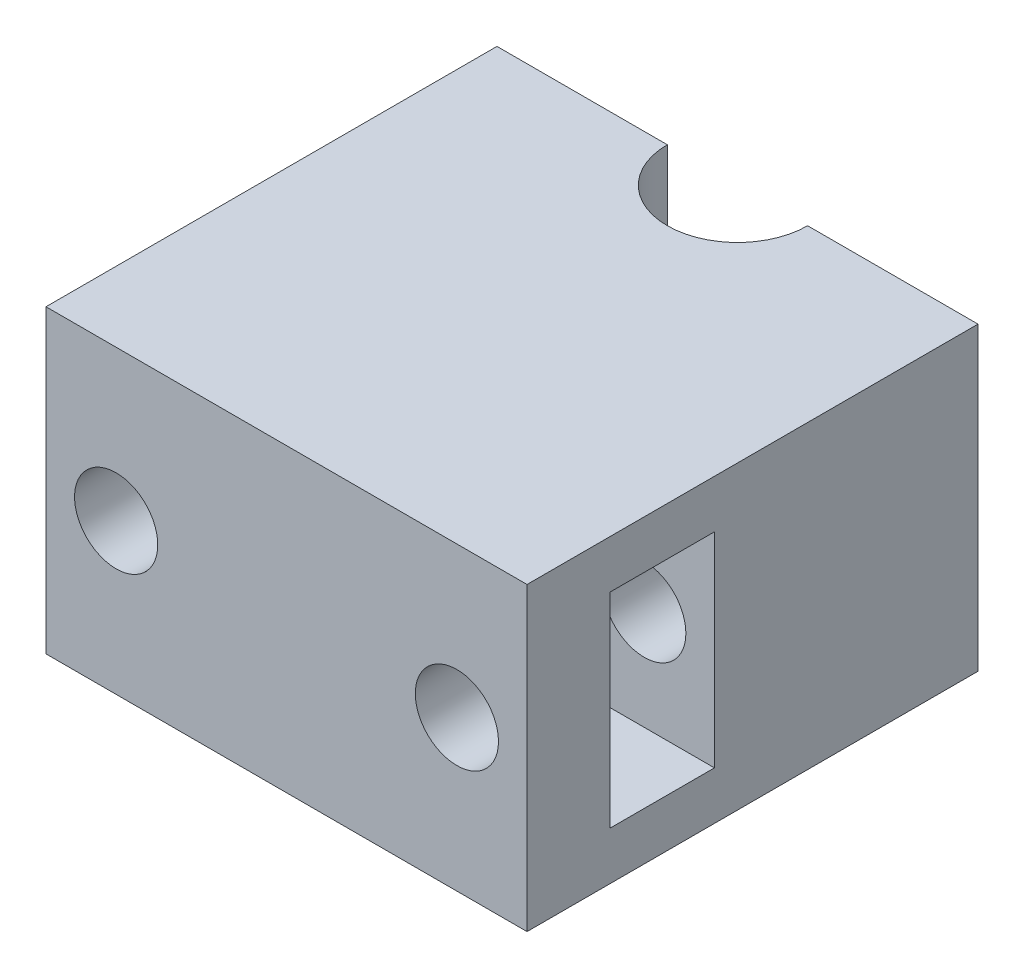
ISO-10303-21;
HEADER;
FILE_DESCRIPTION(('STEP AP214'),'2;1');
FILE_NAME('part.step','',(''),(''),'','','');
FILE_SCHEMA(('AUTOMOTIVE_DESIGN { 1 0 10303 214 1 1 1 1 }'));
ENDSEC;
DATA;
#1=APPLICATION_CONTEXT('core data for automotive mechanical design processes');
#2=APPLICATION_PROTOCOL_DEFINITION('international standard','automotive_design',2000,#1);
#3=PRODUCT_CONTEXT('',#1,'mechanical');
#4=PRODUCT('Part','Part','',(#3));
#5=PRODUCT_RELATED_PRODUCT_CATEGORY('part','',(#4));
#6=PRODUCT_DEFINITION_FORMATION('','',#4);
#7=PRODUCT_DEFINITION_CONTEXT('part definition',#1,'design');
#8=PRODUCT_DEFINITION('design','',#6,#7);
#9=PRODUCT_DEFINITION_SHAPE('','',#8);
#10=(LENGTH_UNIT() NAMED_UNIT(*) SI_UNIT(.MILLI.,.METRE.));
#11=(NAMED_UNIT(*) PLANE_ANGLE_UNIT() SI_UNIT($,.RADIAN.));
#12=(NAMED_UNIT(*) SI_UNIT($,.STERADIAN.) SOLID_ANGLE_UNIT());
#13=UNCERTAINTY_MEASURE_WITH_UNIT(LENGTH_MEASURE(1.E-05),#10,'distance_accuracy_value','');
#14=(GEOMETRIC_REPRESENTATION_CONTEXT(3) GLOBAL_UNCERTAINTY_ASSIGNED_CONTEXT((#13)) GLOBAL_UNIT_ASSIGNED_CONTEXT((#10,
#11,#12)) REPRESENTATION_CONTEXT('',''));
#15=CARTESIAN_POINT('',(0.,0.,0.));
#16=DIRECTION('',(0.,0.,1.));
#17=DIRECTION('',(1.,0.,0.));
#18=AXIS2_PLACEMENT_3D('',#15,#16,#17);
#19=CARTESIAN_POINT('',(24.,30.,-22.5));
#20=DIRECTION('',(0.,0.,1.));
#21=DIRECTION('',(1.,0.,0.));
#22=AXIS2_PLACEMENT_3D('',#19,#20,#21);
#23=PLANE('',#22);
#24=CARTESIAN_POINT('',(-17.,15.,-22.5));
#25=DIRECTION('',(0.,0.,1.));
#26=DIRECTION('',(1.,0.,0.));
#27=AXIS2_PLACEMENT_3D('',#24,#25,#26);
#28=CIRCLE('',#27,4.15);
#29=CARTESIAN_POINT('',(-12.85,15.,-22.5));
#30=VERTEX_POINT('',#29);
#31=EDGE_CURVE('E162',#30,#30,#28,.T.);
#32=ORIENTED_EDGE('',*,*,#31,.T.);
#33=EDGE_LOOP('',(#32));
#34=FACE_BOUND('',#33,.T.);
#35=DIRECTION('',(0.,-1.,0.));
#36=VECTOR('',#35,1.);
#37=CARTESIAN_POINT('',(-7.,137.757696924736,-22.5));
#38=LINE('',#37,#36);
#39=CARTESIAN_POINT('',(-7.,30.,-22.5));
#40=VERTEX_POINT('',#39);
#41=CARTESIAN_POINT('',(-7.,0.,-22.5));
#42=VERTEX_POINT('',#41);
#43=EDGE_CURVE('E143',#40,#42,#38,.T.);
#44=ORIENTED_EDGE('',*,*,#43,.T.);
#45=DIRECTION('',(-1.,0.,0.));
#46=VECTOR('',#45,1.);
#47=CARTESIAN_POINT('',(24.,0.,-22.5));
#48=LINE('',#47,#46);
#49=CARTESIAN_POINT('',(-24.,0.,-22.5));
#50=VERTEX_POINT('',#49);
#51=EDGE_CURVE('E130',#42,#50,#48,.T.);
#52=ORIENTED_EDGE('',*,*,#51,.T.);
#53=DIRECTION('',(0.,-1.,0.));
#54=VECTOR('',#53,1.);
#55=CARTESIAN_POINT('',(-24.,30.,-22.5));
#56=LINE('',#55,#54);
#57=CARTESIAN_POINT('',(-24.,30.,-22.5));
#58=VERTEX_POINT('',#57);
#59=EDGE_CURVE('E215',#58,#50,#56,.T.);
#60=ORIENTED_EDGE('',*,*,#59,.F.);
#61=DIRECTION('',(-1.,0.,0.));
#62=VECTOR('',#61,1.);
#63=CARTESIAN_POINT('',(24.,30.,-22.5));
#64=LINE('',#63,#62);
#65=EDGE_CURVE('E144',#40,#58,#64,.T.);
#66=ORIENTED_EDGE('',*,*,#65,.F.);
#67=EDGE_LOOP('',(#44,#52,#60,#66));
#68=FACE_BOUND('',#67,.T.);
#69=ADVANCED_FACE('F40',(#34,#68),#23,.F.);
#70=CARTESIAN_POINT('',(17.,15.,-22.5));
#71=DIRECTION('',(0.,0.,1.));
#72=DIRECTION('',(1.,0.,0.));
#73=AXIS2_PLACEMENT_3D('',#70,#71,#72);
#74=CIRCLE('',#73,4.15);
#75=CARTESIAN_POINT('',(21.15,15.,-22.5));
#76=VERTEX_POINT('',#75);
#77=EDGE_CURVE('E152',#76,#76,#74,.T.);
#78=ORIENTED_EDGE('',*,*,#77,.T.);
#79=EDGE_LOOP('',(#78));
#80=FACE_BOUND('',#79,.T.);
#81=DIRECTION('',(0.,-1.,0.));
#82=VECTOR('',#81,1.);
#83=CARTESIAN_POINT('',(7.,137.757696924736,-22.5));
#84=LINE('',#83,#82);
#85=CARTESIAN_POINT('',(7.,30.,-22.5));
#86=VERTEX_POINT('',#85);
#87=CARTESIAN_POINT('',(7.,0.,-22.5));
#88=VERTEX_POINT('',#87);
#89=EDGE_CURVE('E63',#86,#88,#84,.T.);
#90=ORIENTED_EDGE('',*,*,#89,.F.);
#91=CARTESIAN_POINT('',(24.,30.,-22.5));
#92=VERTEX_POINT('',#91);
#93=EDGE_CURVE('E213',#92,#86,#64,.T.);
#94=ORIENTED_EDGE('',*,*,#93,.F.);
#95=DIRECTION('',(0.,-1.,0.));
#96=VECTOR('',#95,1.);
#97=CARTESIAN_POINT('',(24.,30.,-22.5));
#98=LINE('',#97,#96);
#99=CARTESIAN_POINT('',(24.,0.,-22.5));
#100=VERTEX_POINT('',#99);
#101=EDGE_CURVE('E221',#92,#100,#98,.T.);
#102=ORIENTED_EDGE('',*,*,#101,.T.);
#103=EDGE_CURVE('E139',#100,#88,#48,.T.);
#104=ORIENTED_EDGE('',*,*,#103,.T.);
#105=EDGE_LOOP('',(#90,#94,#102,#104));
#106=FACE_BOUND('',#105,.T.);
#107=ADVANCED_FACE('F254',(#80,#106),#23,.F.);
#108=CARTESIAN_POINT('',(0.,30.,0.));
#109=DIRECTION('',(0.,1.,0.));
#110=DIRECTION('',(0.,0.,1.));
#111=AXIS2_PLACEMENT_3D('',#108,#109,#110);
#112=PLANE('',#111);
#113=ORIENTED_EDGE('',*,*,#93,.T.);
#114=CARTESIAN_POINT('',(0.,30.,-22.5));
#115=DIRECTION('',(0.,1.,0.));
#116=DIRECTION('',(0.,0.,1.));
#117=AXIS2_PLACEMENT_3D('',#114,#115,#116);
#118=CIRCLE('',#117,7.);
#119=EDGE_CURVE('E55',#86,#40,#118,.F.);
#120=ORIENTED_EDGE('',*,*,#119,.T.);
#121=ORIENTED_EDGE('',*,*,#65,.T.);
#122=DIRECTION('',(0.,0.,1.));
#123=VECTOR('',#122,1.);
#124=CARTESIAN_POINT('',(-24.,30.,22.5));
#125=LINE('',#124,#123);
#126=CARTESIAN_POINT('',(-24.,30.,22.5));
#127=VERTEX_POINT('',#126);
#128=EDGE_CURVE('E205',#58,#127,#125,.T.);
#129=ORIENTED_EDGE('',*,*,#128,.T.);
#130=DIRECTION('',(1.,0.,0.));
#131=VECTOR('',#130,1.);
#132=CARTESIAN_POINT('',(24.,30.,22.5));
#133=LINE('',#132,#131);
#134=CARTESIAN_POINT('',(24.,30.,22.5));
#135=VERTEX_POINT('',#134);
#136=EDGE_CURVE('E208',#127,#135,#133,.T.);
#137=ORIENTED_EDGE('',*,*,#136,.T.);
#138=DIRECTION('',(0.,0.,-1.));
#139=VECTOR('',#138,1.);
#140=CARTESIAN_POINT('',(24.,30.,22.5));
#141=LINE('',#140,#139);
#142=EDGE_CURVE('E210',#135,#92,#141,.T.);
#143=ORIENTED_EDGE('',*,*,#142,.T.);
#144=EDGE_LOOP('',(#113,#120,#121,#129,#137,#143));
#145=FACE_BOUND('',#144,.T.);
#146=ADVANCED_FACE('F260',(#145),#112,.T.);
#147=CARTESIAN_POINT('',(0.,0.,0.));
#148=DIRECTION('',(0.,1.,0.));
#149=DIRECTION('',(0.,0.,1.));
#150=AXIS2_PLACEMENT_3D('',#147,#148,#149);
#151=PLANE('',#150);
#152=CARTESIAN_POINT('',(0.,0.,-22.5));
#153=DIRECTION('',(0.,1.,0.));
#154=DIRECTION('',(0.,0.,1.));
#155=AXIS2_PLACEMENT_3D('',#152,#153,#154);
#156=CIRCLE('',#155,7.);
#157=EDGE_CURVE('E12',#88,#42,#156,.F.);
#158=ORIENTED_EDGE('',*,*,#157,.F.);
#159=ORIENTED_EDGE('',*,*,#103,.F.);
#160=DIRECTION('',(0.,0.,-1.));
#161=VECTOR('',#160,1.);
#162=CARTESIAN_POINT('',(24.,0.,22.5));
#163=LINE('',#162,#161);
#164=CARTESIAN_POINT('',(24.,0.,22.5));
#165=VERTEX_POINT('',#164);
#166=EDGE_CURVE('E140',#165,#100,#163,.T.);
#167=ORIENTED_EDGE('',*,*,#166,.F.);
#168=DIRECTION('',(1.,0.,0.));
#169=VECTOR('',#168,1.);
#170=CARTESIAN_POINT('',(24.,0.,22.5));
#171=LINE('',#170,#169);
#172=CARTESIAN_POINT('',(-24.,0.,22.5));
#173=VERTEX_POINT('',#172);
#174=EDGE_CURVE('E217',#173,#165,#171,.T.);
#175=ORIENTED_EDGE('',*,*,#174,.F.);
#176=DIRECTION('',(0.,0.,1.));
#177=VECTOR('',#176,1.);
#178=CARTESIAN_POINT('',(-24.,0.,22.5));
#179=LINE('',#178,#177);
#180=EDGE_CURVE('E135',#50,#173,#179,.T.);
#181=ORIENTED_EDGE('',*,*,#180,.F.);
#182=ORIENTED_EDGE('',*,*,#51,.F.);
#183=EDGE_LOOP('',(#158,#159,#167,#175,#181,#182));
#184=FACE_BOUND('',#183,.T.);
#185=ADVANCED_FACE('F132',(#184),#151,.F.);
#186=CARTESIAN_POINT('',(-21.,30.,22.5));
#187=DIRECTION('',(1.,0.,0.));
#188=DIRECTION('',(0.,0.,-1.));
#189=AXIS2_PLACEMENT_3D('',#186,#187,#188);
#190=PLANE('',#189);
#191=DIRECTION('',(0.,0.,1.));
#192=VECTOR('',#191,1.);
#193=CARTESIAN_POINT('',(-21.,16.1056672193749,-22.5));
#194=LINE('',#193,#192);
#195=CARTESIAN_POINT('',(-21.,16.1056672193749,3.80000000000001));
#196=VERTEX_POINT('',#195);
#197=CARTESIAN_POINT('',(-21.,16.1056672193749,14.2));
#198=VERTEX_POINT('',#197);
#199=EDGE_CURVE('E48',#196,#198,#194,.T.);
#200=ORIENTED_EDGE('',*,*,#199,.F.);
#201=DIRECTION('',(0.,-1.,0.));
#202=VECTOR('',#201,1.);
#203=CARTESIAN_POINT('',(-21.,4.8,3.80000000000001));
#204=LINE('',#203,#202);
#205=CARTESIAN_POINT('',(-21.,25.2,3.80000000000001));
#206=VERTEX_POINT('',#205);
#207=EDGE_CURVE('E181',#206,#196,#204,.T.);
#208=ORIENTED_EDGE('',*,*,#207,.F.);
#209=DIRECTION('',(0.,0.,-1.));
#210=VECTOR('',#209,1.);
#211=CARTESIAN_POINT('',(-21.,25.2,14.2));
#212=LINE('',#211,#210);
#213=CARTESIAN_POINT('',(-21.,25.2,14.2));
#214=VERTEX_POINT('',#213);
#215=EDGE_CURVE('E184',#214,#206,#212,.T.);
#216=ORIENTED_EDGE('',*,*,#215,.F.);
#217=DIRECTION('',(0.,1.,0.));
#218=VECTOR('',#217,1.);
#219=CARTESIAN_POINT('',(-21.,4.8,14.2));
#220=LINE('',#219,#218);
#221=EDGE_CURVE('E178',#198,#214,#220,.T.);
#222=ORIENTED_EDGE('',*,*,#221,.F.);
#223=EDGE_LOOP('',(#200,#208,#216,#222));
#224=FACE_BOUND('',#223,.T.);
#225=ADVANCED_FACE('F275',(#224),#190,.T.);
#226=CARTESIAN_POINT('',(-24.,30.,22.5));
#227=DIRECTION('',(1.,0.,0.));
#228=DIRECTION('',(0.,0.,-1.));
#229=AXIS2_PLACEMENT_3D('',#226,#227,#228);
#230=PLANE('',#229);
#231=ORIENTED_EDGE('',*,*,#180,.T.);
#232=DIRECTION('',(0.,-1.,0.));
#233=VECTOR('',#232,1.);
#234=CARTESIAN_POINT('',(-24.,30.,22.5));
#235=LINE('',#234,#233);
#236=EDGE_CURVE('E227',#127,#173,#235,.T.);
#237=ORIENTED_EDGE('',*,*,#236,.F.);
#238=ORIENTED_EDGE('',*,*,#128,.F.);
#239=ORIENTED_EDGE('',*,*,#59,.T.);
#240=EDGE_LOOP('',(#231,#237,#238,#239));
#241=FACE_BOUND('',#240,.T.);
#242=ADVANCED_FACE('F42',(#241),#230,.F.);
#243=CARTESIAN_POINT('',(24.,30.,22.5));
#244=DIRECTION('',(0.,0.,-1.));
#245=DIRECTION('',(-1.,0.,0.));
#246=AXIS2_PLACEMENT_3D('',#243,#244,#245);
#247=PLANE('',#246);
#248=CARTESIAN_POINT('',(17.,15.,22.5));
#249=DIRECTION('',(0.,0.,1.));
#250=DIRECTION('',(1.,0.,0.));
#251=AXIS2_PLACEMENT_3D('',#248,#249,#250);
#252=CIRCLE('',#251,4.15);
#253=CARTESIAN_POINT('',(21.15,15.,22.5));
#254=VERTEX_POINT('',#253);
#255=EDGE_CURVE('E149',#254,#254,#252,.T.);
#256=ORIENTED_EDGE('',*,*,#255,.F.);
#257=EDGE_LOOP('',(#256));
#258=FACE_BOUND('',#257,.T.);
#259=CARTESIAN_POINT('',(-17.,15.,22.5));
#260=DIRECTION('',(0.,0.,1.));
#261=DIRECTION('',(1.,0.,0.));
#262=AXIS2_PLACEMENT_3D('',#259,#260,#261);
#263=CIRCLE('',#262,4.15);
#264=CARTESIAN_POINT('',(-12.85,15.,22.5));
#265=VERTEX_POINT('',#264);
#266=EDGE_CURVE('E161',#265,#265,#263,.T.);
#267=ORIENTED_EDGE('',*,*,#266,.F.);
#268=EDGE_LOOP('',(#267));
#269=FACE_BOUND('',#268,.T.);
#270=ORIENTED_EDGE('',*,*,#174,.T.);
#271=DIRECTION('',(0.,-1.,0.));
#272=VECTOR('',#271,1.);
#273=CARTESIAN_POINT('',(24.,30.,22.5));
#274=LINE('',#273,#272);
#275=EDGE_CURVE('E224',#135,#165,#274,.T.);
#276=ORIENTED_EDGE('',*,*,#275,.F.);
#277=ORIENTED_EDGE('',*,*,#136,.F.);
#278=ORIENTED_EDGE('',*,*,#236,.T.);
#279=EDGE_LOOP('',(#270,#276,#277,#278));
#280=FACE_BOUND('',#279,.T.);
#281=ADVANCED_FACE('F268',(#258,#269,#280),#247,.F.);
#282=CARTESIAN_POINT('',(24.,30.,22.5));
#283=DIRECTION('',(-1.,0.,0.));
#284=DIRECTION('',(0.,0.,1.));
#285=AXIS2_PLACEMENT_3D('',#282,#283,#284);
#286=PLANE('',#285);
#287=DIRECTION('',(0.,0.,1.));
#288=VECTOR('',#287,1.);
#289=CARTESIAN_POINT('',(24.,25.2,14.2));
#290=LINE('',#289,#288);
#291=CARTESIAN_POINT('',(24.,25.2,3.80000000000001));
#292=VERTEX_POINT('',#291);
#293=CARTESIAN_POINT('',(24.,25.2,14.2));
#294=VERTEX_POINT('',#293);
#295=EDGE_CURVE('E186',#292,#294,#290,.T.);
#296=ORIENTED_EDGE('',*,*,#295,.F.);
#297=DIRECTION('',(0.,1.,0.));
#298=VECTOR('',#297,1.);
#299=CARTESIAN_POINT('',(24.,4.8,3.80000000000001));
#300=LINE('',#299,#298);
#301=CARTESIAN_POINT('',(24.,4.8,3.80000000000001));
#302=VERTEX_POINT('',#301);
#303=EDGE_CURVE('E173',#302,#292,#300,.T.);
#304=ORIENTED_EDGE('',*,*,#303,.F.);
#305=DIRECTION('',(0.,0.,-1.));
#306=VECTOR('',#305,1.);
#307=CARTESIAN_POINT('',(24.,4.8,14.2));
#308=LINE('',#307,#306);
#309=CARTESIAN_POINT('',(24.,4.8,14.2));
#310=VERTEX_POINT('',#309);
#311=EDGE_CURVE('E192',#310,#302,#308,.T.);
#312=ORIENTED_EDGE('',*,*,#311,.F.);
#313=DIRECTION('',(0.,-1.,0.));
#314=VECTOR('',#313,1.);
#315=CARTESIAN_POINT('',(24.,4.8,14.2));
#316=LINE('',#315,#314);
#317=EDGE_CURVE('E189',#294,#310,#316,.T.);
#318=ORIENTED_EDGE('',*,*,#317,.F.);
#319=EDGE_LOOP('',(#296,#304,#312,#318));
#320=FACE_BOUND('',#319,.T.);
#321=ORIENTED_EDGE('',*,*,#166,.T.);
#322=ORIENTED_EDGE('',*,*,#101,.F.);
#323=ORIENTED_EDGE('',*,*,#142,.F.);
#324=ORIENTED_EDGE('',*,*,#275,.T.);
#325=EDGE_LOOP('',(#321,#322,#323,#324));
#326=FACE_BOUND('',#325,.T.);
#327=ADVANCED_FACE('F265',(#320,#326),#286,.F.);
#328=CARTESIAN_POINT('',(-46.8980348501787,4.8,3.80000000000001));
#329=DIRECTION('',(0.,0.,-1.));
#330=DIRECTION('',(-1.,0.,0.));
#331=AXIS2_PLACEMENT_3D('',#328,#329,#330);
#332=PLANE('',#331);
#333=CARTESIAN_POINT('',(17.,15.,3.80000000000001));
#334=DIRECTION('',(0.,0.,-1.));
#335=DIRECTION('',(-1.,0.,0.));
#336=AXIS2_PLACEMENT_3D('',#333,#334,#335);
#337=CIRCLE('',#336,4.15);
#338=CARTESIAN_POINT('',(21.15,15.,3.80000000000001));
#339=VERTEX_POINT('',#338);
#340=EDGE_CURVE('E158',#339,#339,#337,.T.);
#341=ORIENTED_EDGE('',*,*,#340,.T.);
#342=EDGE_LOOP('',(#341));
#343=FACE_BOUND('',#342,.T.);
#344=ORIENTED_EDGE('',*,*,#207,.T.);
#345=CARTESIAN_POINT('',(-17.,15.,3.80000000000001));
#346=DIRECTION('',(0.,0.,-1.));
#347=DIRECTION('',(-1.,0.,0.));
#348=AXIS2_PLACEMENT_3D('',#345,#346,#347);
#349=CIRCLE('',#348,4.15);
#350=CARTESIAN_POINT('',(-21.,13.8943327806251,3.80000000000001));
#351=VERTEX_POINT('',#350);
#352=EDGE_CURVE('E170',#196,#351,#349,.T.);
#353=ORIENTED_EDGE('',*,*,#352,.T.);
#354=CARTESIAN_POINT('',(-21.,4.8,3.80000000000001));
#355=VERTEX_POINT('',#354);
#356=EDGE_CURVE('E180',#351,#355,#204,.T.);
#357=ORIENTED_EDGE('',*,*,#356,.T.);
#358=DIRECTION('',(1.,0.,0.));
#359=VECTOR('',#358,1.);
#360=CARTESIAN_POINT('',(-46.8980348501787,4.8,3.80000000000001));
#361=LINE('',#360,#359);
#362=EDGE_CURVE('E196',#355,#302,#361,.T.);
#363=ORIENTED_EDGE('',*,*,#362,.T.);
#364=ORIENTED_EDGE('',*,*,#303,.T.);
#365=DIRECTION('',(1.,0.,0.));
#366=VECTOR('',#365,1.);
#367=CARTESIAN_POINT('',(-46.8980348501787,25.2,3.80000000000001));
#368=LINE('',#367,#366);
#369=EDGE_CURVE('E195',#206,#292,#368,.T.);
#370=ORIENTED_EDGE('',*,*,#369,.F.);
#371=EDGE_LOOP('',(#344,#353,#357,#363,#364,#370));
#372=FACE_BOUND('',#371,.T.);
#373=ADVANCED_FACE('F267',(#343,#372),#332,.F.);
#374=CARTESIAN_POINT('',(-46.8980348501787,4.8,14.2));
#375=DIRECTION('',(0.,-1.,0.));
#376=DIRECTION('',(0.,0.,-1.));
#377=AXIS2_PLACEMENT_3D('',#374,#375,#376);
#378=PLANE('',#377);
#379=DIRECTION('',(0.,0.,1.));
#380=VECTOR('',#379,1.);
#381=CARTESIAN_POINT('',(-21.,4.8,14.2));
#382=LINE('',#381,#380);
#383=CARTESIAN_POINT('',(-21.,4.8,14.2));
#384=VERTEX_POINT('',#383);
#385=EDGE_CURVE('E177',#355,#384,#382,.T.);
#386=ORIENTED_EDGE('',*,*,#385,.T.);
#387=DIRECTION('',(1.,0.,0.));
#388=VECTOR('',#387,1.);
#389=CARTESIAN_POINT('',(-46.8980348501787,4.8,14.2));
#390=LINE('',#389,#388);
#391=EDGE_CURVE('E198',#384,#310,#390,.T.);
#392=ORIENTED_EDGE('',*,*,#391,.T.);
#393=ORIENTED_EDGE('',*,*,#311,.T.);
#394=ORIENTED_EDGE('',*,*,#362,.F.);
#395=EDGE_LOOP('',(#386,#392,#393,#394));
#396=FACE_BOUND('',#395,.T.);
#397=ADVANCED_FACE('F295',(#396),#378,.F.);
#398=CARTESIAN_POINT('',(-46.8980348501787,4.8,14.2));
#399=DIRECTION('',(0.,0.,1.));
#400=DIRECTION('',(1.,0.,0.));
#401=AXIS2_PLACEMENT_3D('',#398,#399,#400);
#402=PLANE('',#401);
#403=CARTESIAN_POINT('',(17.,15.,14.2));
#404=DIRECTION('',(0.,0.,1.));
#405=DIRECTION('',(1.,0.,0.));
#406=AXIS2_PLACEMENT_3D('',#403,#404,#405);
#407=CIRCLE('',#406,4.15);
#408=CARTESIAN_POINT('',(21.15,15.,14.2));
#409=VERTEX_POINT('',#408);
#410=EDGE_CURVE('E155',#409,#409,#407,.T.);
#411=ORIENTED_EDGE('',*,*,#410,.T.);
#412=EDGE_LOOP('',(#411));
#413=FACE_BOUND('',#412,.T.);
#414=CARTESIAN_POINT('',(-21.,13.8943327806251,14.2));
#415=VERTEX_POINT('',#414);
#416=EDGE_CURVE('E174',#384,#415,#220,.T.);
#417=ORIENTED_EDGE('',*,*,#416,.T.);
#418=CARTESIAN_POINT('',(-17.,15.,14.2));
#419=DIRECTION('',(0.,0.,1.));
#420=DIRECTION('',(1.,0.,0.));
#421=AXIS2_PLACEMENT_3D('',#418,#419,#420);
#422=CIRCLE('',#421,4.15);
#423=EDGE_CURVE('E165',#415,#198,#422,.T.);
#424=ORIENTED_EDGE('',*,*,#423,.T.);
#425=ORIENTED_EDGE('',*,*,#221,.T.);
#426=DIRECTION('',(1.,0.,0.));
#427=VECTOR('',#426,1.);
#428=CARTESIAN_POINT('',(-46.8980348501787,25.2,14.2));
#429=LINE('',#428,#427);
#430=EDGE_CURVE('E200',#214,#294,#429,.T.);
#431=ORIENTED_EDGE('',*,*,#430,.T.);
#432=ORIENTED_EDGE('',*,*,#317,.T.);
#433=ORIENTED_EDGE('',*,*,#391,.F.);
#434=EDGE_LOOP('',(#417,#424,#425,#431,#432,#433));
#435=FACE_BOUND('',#434,.T.);
#436=ADVANCED_FACE('F235',(#413,#435),#402,.F.);
#437=CARTESIAN_POINT('',(-46.8980348501787,25.2,14.2));
#438=DIRECTION('',(0.,1.,0.));
#439=DIRECTION('',(0.,0.,1.));
#440=AXIS2_PLACEMENT_3D('',#437,#438,#439);
#441=PLANE('',#440);
#442=ORIENTED_EDGE('',*,*,#215,.T.);
#443=ORIENTED_EDGE('',*,*,#369,.T.);
#444=ORIENTED_EDGE('',*,*,#295,.T.);
#445=ORIENTED_EDGE('',*,*,#430,.F.);
#446=EDGE_LOOP('',(#442,#443,#444,#445));
#447=FACE_BOUND('',#446,.T.);
#448=ADVANCED_FACE('F297',(#447),#441,.F.);
#449=DIRECTION('',(0.,0.,1.));
#450=VECTOR('',#449,1.);
#451=CARTESIAN_POINT('',(-21.,13.8943327806251,-22.5));
#452=LINE('',#451,#450);
#453=EDGE_CURVE('E230',#415,#351,#452,.F.);
#454=ORIENTED_EDGE('',*,*,#453,.F.);
#455=ORIENTED_EDGE('',*,*,#416,.F.);
#456=ORIENTED_EDGE('',*,*,#385,.F.);
#457=ORIENTED_EDGE('',*,*,#356,.F.);
#458=EDGE_LOOP('',(#454,#455,#456,#457));
#459=FACE_BOUND('',#458,.T.);
#460=ADVANCED_FACE('F249',(#459),#190,.T.);
#461=CARTESIAN_POINT('',(-17.,15.,-22.5));
#462=DIRECTION('',(0.,0.,1.));
#463=DIRECTION('',(1.,0.,0.));
#464=AXIS2_PLACEMENT_3D('',#461,#462,#463);
#465=CYLINDRICAL_SURFACE('',#464,4.15);
#466=ORIENTED_EDGE('',*,*,#199,.T.);
#467=ORIENTED_EDGE('',*,*,#423,.F.);
#468=ORIENTED_EDGE('',*,*,#453,.T.);
#469=ORIENTED_EDGE('',*,*,#352,.F.);
#470=EDGE_LOOP('',(#466,#467,#468,#469));
#471=FACE_BOUND('',#470,.T.);
#472=ORIENTED_EDGE('',*,*,#31,.F.);
#473=EDGE_LOOP('',(#472));
#474=FACE_BOUND('',#473,.T.);
#475=ORIENTED_EDGE('',*,*,#266,.T.);
#476=EDGE_LOOP('',(#475));
#477=FACE_BOUND('',#476,.T.);
#478=ADVANCED_FACE('F241',(#471,#474,#477),#465,.F.);
#479=CARTESIAN_POINT('',(17.,15.,-22.5));
#480=DIRECTION('',(0.,0.,1.));
#481=DIRECTION('',(1.,0.,0.));
#482=AXIS2_PLACEMENT_3D('',#479,#480,#481);
#483=CYLINDRICAL_SURFACE('',#482,4.15);
#484=CARTESIAN_POINT('',(21.15,15.,22.5));
#485=CARTESIAN_POINT('',(21.15,15.,22.4135416666667));
#486=CARTESIAN_POINT('',(21.15,15.,22.3270833333333));
#487=CARTESIAN_POINT('',(21.15,15.,22.1541666666667));
#488=CARTESIAN_POINT('',(21.15,15.,22.0677083333333));
#489=CARTESIAN_POINT('',(21.15,15.,21.8947916666667));
#490=CARTESIAN_POINT('',(21.15,15.,21.8083333333333));
#491=CARTESIAN_POINT('',(21.15,15.,21.6354166666667));
#492=CARTESIAN_POINT('',(21.15,15.,21.5489583333333));
#493=CARTESIAN_POINT('',(21.15,15.,21.3760416666667));
#494=CARTESIAN_POINT('',(21.15,15.,21.2895833333333));
#495=CARTESIAN_POINT('',(21.15,15.,21.1166666666667));
#496=CARTESIAN_POINT('',(21.15,15.,21.0302083333333));
#497=CARTESIAN_POINT('',(21.15,15.,20.8572916666667));
#498=CARTESIAN_POINT('',(21.15,15.,20.7708333333333));
#499=CARTESIAN_POINT('',(21.15,15.,20.5979166666667));
#500=CARTESIAN_POINT('',(21.15,15.,20.5114583333333));
#501=CARTESIAN_POINT('',(21.15,15.,20.3385416666667));
#502=CARTESIAN_POINT('',(21.15,15.,20.2520833333333));
#503=CARTESIAN_POINT('',(21.15,15.,20.0791666666667));
#504=CARTESIAN_POINT('',(21.15,15.,19.9927083333333));
#505=CARTESIAN_POINT('',(21.15,15.,19.8197916666667));
#506=CARTESIAN_POINT('',(21.15,15.,19.7333333333333));
#507=CARTESIAN_POINT('',(21.15,15.,19.5604166666667));
#508=CARTESIAN_POINT('',(21.15,15.,19.4739583333333));
#509=CARTESIAN_POINT('',(21.15,15.,19.3010416666667));
#510=CARTESIAN_POINT('',(21.15,15.,19.2145833333333));
#511=CARTESIAN_POINT('',(21.15,15.,19.0416666666667));
#512=CARTESIAN_POINT('',(21.15,15.,18.9552083333333));
#513=CARTESIAN_POINT('',(21.15,15.,18.7822916666667));
#514=CARTESIAN_POINT('',(21.15,15.,18.6958333333333));
#515=CARTESIAN_POINT('',(21.15,15.,18.5229166666667));
#516=CARTESIAN_POINT('',(21.15,15.,18.4364583333333));
#517=CARTESIAN_POINT('',(21.15,15.,18.2635416666667));
#518=CARTESIAN_POINT('',(21.15,15.,18.1770833333333));
#519=CARTESIAN_POINT('',(21.15,15.,18.0041666666667));
#520=CARTESIAN_POINT('',(21.15,15.,17.9177083333333));
#521=CARTESIAN_POINT('',(21.15,15.,17.7447916666667));
#522=CARTESIAN_POINT('',(21.15,15.,17.6583333333333));
#523=CARTESIAN_POINT('',(21.15,15.,17.4854166666667));
#524=CARTESIAN_POINT('',(21.15,15.,17.3989583333333));
#525=CARTESIAN_POINT('',(21.15,15.,17.2260416666667));
#526=CARTESIAN_POINT('',(21.15,15.,17.1395833333333));
#527=CARTESIAN_POINT('',(21.15,15.,16.9666666666667));
#528=CARTESIAN_POINT('',(21.15,15.,16.8802083333333));
#529=CARTESIAN_POINT('',(21.15,15.,16.7072916666667));
#530=CARTESIAN_POINT('',(21.15,15.,16.6208333333333));
#531=CARTESIAN_POINT('',(21.15,15.,16.4479166666667));
#532=CARTESIAN_POINT('',(21.15,15.,16.3614583333333));
#533=CARTESIAN_POINT('',(21.15,15.,16.1885416666667));
#534=CARTESIAN_POINT('',(21.15,15.,16.1020833333333));
#535=CARTESIAN_POINT('',(21.15,15.,15.9291666666667));
#536=CARTESIAN_POINT('',(21.15,15.,15.8427083333333));
#537=CARTESIAN_POINT('',(21.15,15.,15.6697916666667));
#538=CARTESIAN_POINT('',(21.15,15.,15.5833333333333));
#539=CARTESIAN_POINT('',(21.15,15.,15.4104166666667));
#540=CARTESIAN_POINT('',(21.15,15.,15.3239583333333));
#541=CARTESIAN_POINT('',(21.15,15.,15.1510416666667));
#542=CARTESIAN_POINT('',(21.15,15.,15.0645833333333));
#543=CARTESIAN_POINT('',(21.15,15.,14.8916666666667));
#544=CARTESIAN_POINT('',(21.15,15.,14.8052083333333));
#545=CARTESIAN_POINT('',(21.15,15.,14.6322916666667));
#546=CARTESIAN_POINT('',(21.15,15.,14.5458333333333));
#547=CARTESIAN_POINT('',(21.15,15.,14.3729166666667));
#548=CARTESIAN_POINT('',(21.15,15.,14.2864583333333));
#549=CARTESIAN_POINT('',(21.15,15.,14.2));
#550=B_SPLINE_CURVE_WITH_KNOTS('',3,(#484,#485,#486,#487,#488,#489,#490,#491,#492,#493,#494,
#495,#496,#497,#498,#499,#500,#501,#502,#503,#504,#505,#506,#507,#508,#509,#510,#511,#512,#513,
#514,#515,#516,#517,#518,#519,#520,#521,#522,#523,#524,#525,#526,#527,#528,#529,#530,#531,#532,
#533,#534,#535,#536,#537,#538,#539,#540,#541,#542,#543,#544,#545,#546,#547,#548,#549),
.UNSPECIFIED.,.F.,.F.,(4,2,2,2,2,2,2,2,2,2,2,2,2,2,2,2,2,2,2,2,2,2,2,2,2,2,2,2,2,2,2,2,4),(0.,
0.259374999999999,0.518749999999998,0.778124999999998,1.0375,1.296875,1.55625,1.81562499999999,
2.07499999999999,2.334375,2.59375,2.853125,3.1125,3.371875,3.63125,3.89062499999999,
4.14999999999999,4.40937499999999,4.66874999999999,4.92812499999999,5.18749999999999,
5.44687499999999,5.70624999999999,5.96562499999999,6.22499999999999,6.48437499999999,
6.74374999999999,7.00312499999999,7.26249999999999,7.52187499999999,7.78124999999999,
8.04062499999999,8.29999999999999),.UNSPECIFIED.);
#551=EDGE_CURVE('BSEAM238',#254,#409,#550,.T.);
#552=ORIENTED_EDGE('',*,*,#255,.T.);
#553=ORIENTED_EDGE('',*,*,#410,.F.);
#554=ORIENTED_EDGE('',*,*,#551,.T.);
#555=ORIENTED_EDGE('',*,*,#551,.F.);
#556=EDGE_LOOP('',(#552,#554,#553,#555));
#557=FACE_BOUND('',#556,.T.);
#558=ADVANCED_FACE('F238',(#557),#483,.F.);
#559=CARTESIAN_POINT('',(21.15,15.,-22.5));
#560=CARTESIAN_POINT('',(21.15,15.,-22.2260416666667));
#561=CARTESIAN_POINT('',(21.15,15.,-21.9520833333333));
#562=CARTESIAN_POINT('',(21.15,15.,-21.4041666666667));
#563=CARTESIAN_POINT('',(21.15,15.,-21.1302083333333));
#564=CARTESIAN_POINT('',(21.15,15.,-20.5822916666667));
#565=CARTESIAN_POINT('',(21.15,15.,-20.3083333333333));
#566=CARTESIAN_POINT('',(21.15,15.,-19.7604166666667));
#567=CARTESIAN_POINT('',(21.15,15.,-19.4864583333333));
#568=CARTESIAN_POINT('',(21.15,15.,-18.9385416666667));
#569=CARTESIAN_POINT('',(21.15,15.,-18.6645833333333));
#570=CARTESIAN_POINT('',(21.15,15.,-18.1166666666667));
#571=CARTESIAN_POINT('',(21.15,15.,-17.8427083333333));
#572=CARTESIAN_POINT('',(21.15,15.,-17.2947916666667));
#573=CARTESIAN_POINT('',(21.15,15.,-17.0208333333333));
#574=CARTESIAN_POINT('',(21.15,15.,-16.4729166666667));
#575=CARTESIAN_POINT('',(21.15,15.,-16.1989583333333));
#576=CARTESIAN_POINT('',(21.15,15.,-15.6510416666667));
#577=CARTESIAN_POINT('',(21.15,15.,-15.3770833333333));
#578=CARTESIAN_POINT('',(21.15,15.,-14.8291666666667));
#579=CARTESIAN_POINT('',(21.15,15.,-14.5552083333333));
#580=CARTESIAN_POINT('',(21.15,15.,-14.0072916666667));
#581=CARTESIAN_POINT('',(21.15,15.,-13.7333333333333));
#582=CARTESIAN_POINT('',(21.15,15.,-13.1854166666667));
#583=CARTESIAN_POINT('',(21.15,15.,-12.9114583333333));
#584=CARTESIAN_POINT('',(21.15,15.,-12.3635416666667));
#585=CARTESIAN_POINT('',(21.15,15.,-12.0895833333333));
#586=CARTESIAN_POINT('',(21.15,15.,-11.5416666666667));
#587=CARTESIAN_POINT('',(21.15,15.,-11.2677083333333));
#588=CARTESIAN_POINT('',(21.15,15.,-10.7197916666667));
#589=CARTESIAN_POINT('',(21.15,15.,-10.4458333333333));
#590=CARTESIAN_POINT('',(21.15,15.,-9.89791666666666));
#591=CARTESIAN_POINT('',(21.15,15.,-9.62395833333333));
#592=CARTESIAN_POINT('',(21.15,15.,-9.07604166666666));
#593=CARTESIAN_POINT('',(21.15,15.,-8.80208333333333));
#594=CARTESIAN_POINT('',(21.15,15.,-8.25416666666666));
#595=CARTESIAN_POINT('',(21.15,15.,-7.98020833333333));
#596=CARTESIAN_POINT('',(21.15,15.,-7.43229166666666));
#597=CARTESIAN_POINT('',(21.15,15.,-7.15833333333333));
#598=CARTESIAN_POINT('',(21.15,15.,-6.61041666666666));
#599=CARTESIAN_POINT('',(21.15,15.,-6.33645833333332));
#600=CARTESIAN_POINT('',(21.15,15.,-5.78854166666666));
#601=CARTESIAN_POINT('',(21.15,15.,-5.51458333333333));
#602=CARTESIAN_POINT('',(21.15,15.,-4.96666666666666));
#603=CARTESIAN_POINT('',(21.15,15.,-4.69270833333333));
#604=CARTESIAN_POINT('',(21.15,15.,-4.14479166666666));
#605=CARTESIAN_POINT('',(21.15,15.,-3.87083333333333));
#606=CARTESIAN_POINT('',(21.15,15.,-3.32291666666666));
#607=CARTESIAN_POINT('',(21.15,15.,-3.04895833333333));
#608=CARTESIAN_POINT('',(21.15,15.,-2.50104166666666));
#609=CARTESIAN_POINT('',(21.15,15.,-2.22708333333332));
#610=CARTESIAN_POINT('',(21.15,15.,-1.67916666666666));
#611=CARTESIAN_POINT('',(21.15,15.,-1.40520833333332));
#612=CARTESIAN_POINT('',(21.15,15.,-0.857291666666657));
#613=CARTESIAN_POINT('',(21.15,15.,-0.583333333333323));
#614=CARTESIAN_POINT('',(21.15,15.,-0.035416666666657));
#615=CARTESIAN_POINT('',(21.15,15.,0.238541666666676));
#616=CARTESIAN_POINT('',(21.15,15.,0.786458333333343));
#617=CARTESIAN_POINT('',(21.15,15.,1.06041666666668));
#618=CARTESIAN_POINT('',(21.15,15.,1.60833333333334));
#619=CARTESIAN_POINT('',(21.15,15.,1.88229166666668));
#620=CARTESIAN_POINT('',(21.15,15.,2.43020833333335));
#621=CARTESIAN_POINT('',(21.15,15.,2.70416666666668));
#622=CARTESIAN_POINT('',(21.15,15.,3.25208333333335));
#623=CARTESIAN_POINT('',(21.15,15.,3.52604166666668));
#624=CARTESIAN_POINT('',(21.15,15.,3.80000000000001));
#625=B_SPLINE_CURVE_WITH_KNOTS('',3,(#559,#560,#561,#562,#563,#564,#565,#566,#567,#568,#569,
#570,#571,#572,#573,#574,#575,#576,#577,#578,#579,#580,#581,#582,#583,#584,#585,#586,#587,#588,
#589,#590,#591,#592,#593,#594,#595,#596,#597,#598,#599,#600,#601,#602,#603,#604,#605,#606,#607,
#608,#609,#610,#611,#612,#613,#614,#615,#616,#617,#618,#619,#620,#621,#622,#623,#624),
.UNSPECIFIED.,.F.,.F.,(4,2,2,2,2,2,2,2,2,2,2,2,2,2,2,2,2,2,2,2,2,2,2,2,2,2,2,2,2,2,2,2,4),(0.,
0.821875,1.64375,2.465625,3.2875,4.109375,4.93125,5.753125,6.575,7.396875,8.21875,9.040625,
9.8625,10.684375,11.50625,12.328125,13.15,13.971875,14.79375,15.615625,16.4375,17.259375,
18.08125,18.903125,19.725,20.546875,21.36875,22.190625,23.0125,23.834375,24.65625,25.478125,
26.3),.UNSPECIFIED.);
#626=EDGE_CURVE('BSEAM240',#76,#339,#625,.T.);
#627=ORIENTED_EDGE('',*,*,#77,.F.);
#628=ORIENTED_EDGE('',*,*,#340,.F.);
#629=ORIENTED_EDGE('',*,*,#626,.T.);
#630=ORIENTED_EDGE('',*,*,#626,.F.);
#631=EDGE_LOOP('',(#627,#629,#628,#630));
#632=FACE_BOUND('',#631,.T.);
#633=ADVANCED_FACE('F240',(#632),#483,.F.);
#634=CARTESIAN_POINT('',(0.,137.757696924736,-22.5));
#635=DIRECTION('',(0.,-1.,0.));
#636=DIRECTION('',(0.,0.,-1.));
#637=AXIS2_PLACEMENT_3D('',#634,#635,#636);
#638=CYLINDRICAL_SURFACE('',#637,7.);
#639=ORIENTED_EDGE('',*,*,#119,.F.);
#640=ORIENTED_EDGE('',*,*,#89,.T.);
#641=ORIENTED_EDGE('',*,*,#157,.T.);
#642=ORIENTED_EDGE('',*,*,#43,.F.);
#643=EDGE_LOOP('',(#639,#640,#641,#642));
#644=FACE_BOUND('',#643,.T.);
#645=ADVANCED_FACE('F147',(#644),#638,.F.);
#646=CLOSED_SHELL('',(#69,#107,#146,#185,#225,#242,#281,#327,#373,#397,#436,#448,#460,#478,#558,
#633,#645));
#647=MANIFOLD_SOLID_BREP('B2',#646);
#648=ADVANCED_BREP_SHAPE_REPRESENTATION('',(#18,#647),#14);
#649=SHAPE_DEFINITION_REPRESENTATION(#9,#648);
ENDSEC;
END-ISO-10303-21;
